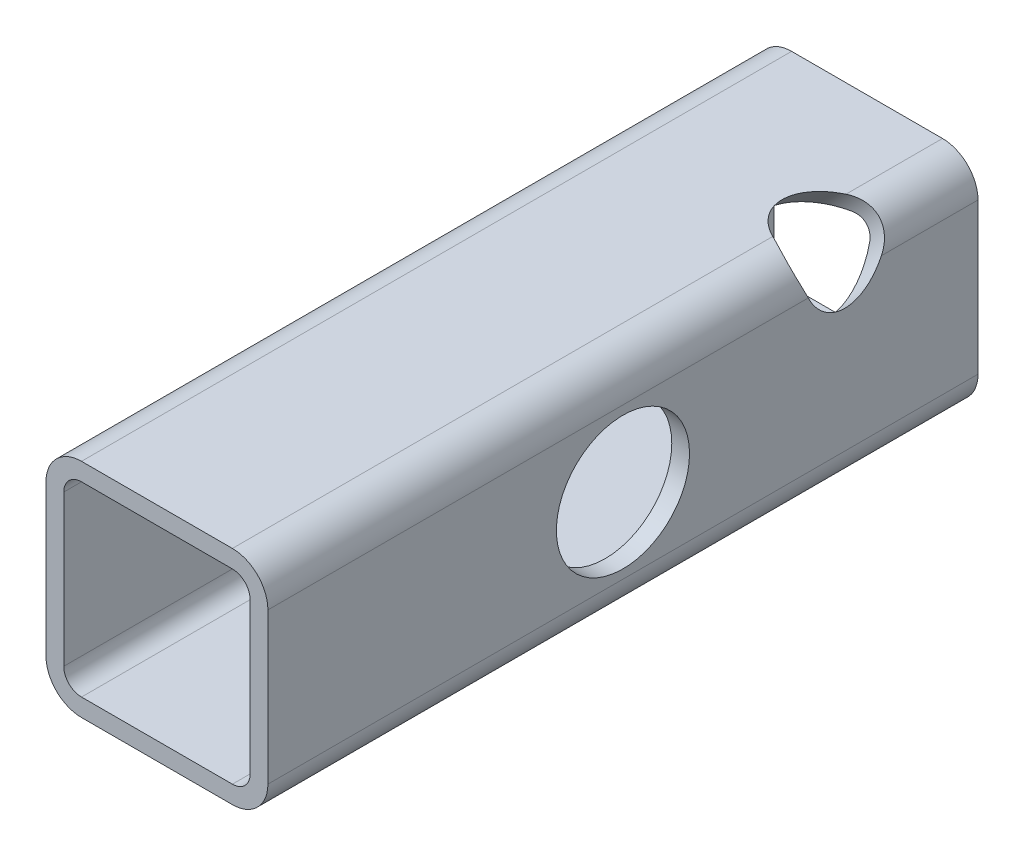
ISO-10303-21;
HEADER;
FILE_DESCRIPTION(('STEP AP214'),'2;1');
FILE_NAME('part.step','',(''),(''),'','','');
FILE_SCHEMA(('AUTOMOTIVE_DESIGN { 1 0 10303 214 1 1 1 1 }'));
ENDSEC;
DATA;
#1=APPLICATION_CONTEXT('core data for automotive mechanical design processes');
#2=APPLICATION_PROTOCOL_DEFINITION('international standard','automotive_design',2000,#1);
#3=PRODUCT_CONTEXT('',#1,'mechanical');
#4=PRODUCT('Part','Part','',(#3));
#5=PRODUCT_RELATED_PRODUCT_CATEGORY('part','',(#4));
#6=PRODUCT_DEFINITION_FORMATION('','',#4);
#7=PRODUCT_DEFINITION_CONTEXT('part definition',#1,'design');
#8=PRODUCT_DEFINITION('design','',#6,#7);
#9=PRODUCT_DEFINITION_SHAPE('','',#8);
#10=(LENGTH_UNIT() NAMED_UNIT(*) SI_UNIT(.MILLI.,.METRE.));
#11=(NAMED_UNIT(*) PLANE_ANGLE_UNIT() SI_UNIT($,.RADIAN.));
#12=(NAMED_UNIT(*) SI_UNIT($,.STERADIAN.) SOLID_ANGLE_UNIT());
#13=UNCERTAINTY_MEASURE_WITH_UNIT(LENGTH_MEASURE(1.E-05),#10,'distance_accuracy_value','');
#14=(GEOMETRIC_REPRESENTATION_CONTEXT(3) GLOBAL_UNCERTAINTY_ASSIGNED_CONTEXT((#13)) GLOBAL_UNIT_ASSIGNED_CONTEXT((#10,
#11,#12)) REPRESENTATION_CONTEXT('',''));
#15=CARTESIAN_POINT('',(0.,0.,0.));
#16=DIRECTION('',(0.,0.,1.));
#17=DIRECTION('',(1.,0.,0.));
#18=AXIS2_PLACEMENT_3D('',#15,#16,#17);
#19=CARTESIAN_POINT('',(8.5,8.5,80.));
#20=DIRECTION('',(0.,0.,-1.));
#21=DIRECTION('',(-1.,0.,0.));
#22=AXIS2_PLACEMENT_3D('',#19,#20,#21);
#23=CYLINDRICAL_SURFACE('',#22,4.);
#24=CARTESIAN_POINT('',(12.5,8.5,10.8768943743823));
#25=CARTESIAN_POINT('',(12.4999900736932,8.60322548582175,10.8268117894162));
#26=CARTESIAN_POINT('',(12.4960026516083,8.70684373620168,10.777473282216));
#27=CARTESIAN_POINT('',(12.4798211637723,8.9146339749652,10.6810516297764));
#28=CARTESIAN_POINT('',(12.4676172554053,9.01880647863846,10.6339712621303));
#29=CARTESIAN_POINT('',(12.4346362042789,9.22794552261682,10.5426421700863));
#30=CARTESIAN_POINT('',(12.4138002846389,9.33291256654859,10.4984153094687));
#31=CARTESIAN_POINT('',(12.3633247715153,9.54227431499125,10.4140348078421));
#32=CARTESIAN_POINT('',(12.3336893465361,9.64666926671869,10.3738792502298));
#33=CARTESIAN_POINT('',(12.2418879174214,9.92551716225092,10.2726151327423));
#34=CARTESIAN_POINT('',(12.1713387006105,10.0990244436357,10.2159727240534));
#35=CARTESIAN_POINT('',(12.0461455016184,10.3530466996695,10.1445602283934));
#36=CARTESIAN_POINT('',(12.0012344812091,10.436609822726,10.1230276605347));
#37=CARTESIAN_POINT('',(11.9050424995219,10.6011294313171,10.0848456206906));
#38=CARTESIAN_POINT('',(11.8537646982885,10.6820871850566,10.0681937399416));
#39=CARTESIAN_POINT('',(11.7446624441855,10.8412699476428,10.0400398488812));
#40=CARTESIAN_POINT('',(11.6867943264408,10.919471627163,10.0285750279255));
#41=CARTESIAN_POINT('',(11.5651945183113,11.0717842756467,10.0112404242424));
#42=CARTESIAN_POINT('',(11.5014653122967,11.1458969567168,10.0053682827932));
#43=CARTESIAN_POINT('',(11.3685706275076,11.2894207030943,9.99935733347444));
#44=CARTESIAN_POINT('',(11.2994018420552,11.3588288600808,9.99922204040594));
#45=CARTESIAN_POINT('',(11.1563057283572,11.4922612010786,10.0046869065742));
#46=CARTESIAN_POINT('',(11.082378722107,11.5562857487314,10.010286678093));
#47=CARTESIAN_POINT('',(10.8688957305008,11.727902135089,10.0339228888907));
#48=CARTESIAN_POINT('',(10.7246003406474,11.8288697360653,10.0583538077691));
#49=CARTESIAN_POINT('',(10.4269881402968,12.0095740260143,10.123784696369));
#50=CARTESIAN_POINT('',(10.2736712366654,12.089310495759,10.1647848371696));
#51=CARTESIAN_POINT('',(9.95316360050183,12.2310465588378,10.2632966851238));
#52=CARTESIAN_POINT('',(9.78567567291917,12.2918115493848,10.3216005596071));
#53=CARTESIAN_POINT('',(9.44839970680853,12.3899139893728,10.4500976510045));
#54=CARTESIAN_POINT('',(9.27861027278672,12.4272365101349,10.5202984080596));
#55=CARTESIAN_POINT('',(9.00702186327651,12.4690796452538,10.6392643664434));
#56=CARTESIAN_POINT('',(8.90509562652709,12.4807451000738,10.6854215521429));
#57=CARTESIAN_POINT('',(8.70199886997217,12.4961864267963,10.7797819561551));
#58=CARTESIAN_POINT('',(8.60082696607659,12.4999882262497,10.8279779142022));
#59=CARTESIAN_POINT('',(8.5,12.5,10.8768943743824));
#60=B_SPLINE_CURVE_WITH_KNOTS('',3,(#24,#25,#26,#27,#28,#29,#30,#31,#32,#33,#34,#35,#36,#37,#38,
#39,#40,#41,#42,#43,#44,#45,#46,#47,#48,#49,#50,#51,#52,#53,#54,#55,#56,#57,#58,#59),
.UNSPECIFIED.,.F.,.F.,(4,2,2,2,2,2,2,2,2,2,2,2,2,2,2,2,2,4),(0.,0.344169396618335,
0.688751812699603,1.03572015363021,1.38252439013617,1.96665480854207,2.25820455863998,
2.54961017708636,2.84307318850472,3.13641237653447,3.42993128240602,3.72343034629238,
4.25421029629236,4.78499572679712,5.34533149161232,5.90602372970775,6.24324687063367,
6.5793563566241),.UNSPECIFIED.);
#61=CARTESIAN_POINT('',(12.5,8.5,10.8768943743823));
#62=VERTEX_POINT('',#61);
#63=CARTESIAN_POINT('',(8.5,12.5,10.8768943743824));
#64=VERTEX_POINT('',#63);
#65=EDGE_CURVE('E47',#62,#64,#60,.T.);
#66=ORIENTED_EDGE('',*,*,#65,.F.);
#67=DIRECTION('',(0.,0.,-1.));
#68=VECTOR('',#67,1.);
#69=CARTESIAN_POINT('',(12.5,8.5,80.));
#70=LINE('',#69,#68);
#71=CARTESIAN_POINT('',(12.5,8.5,0.));
#72=VERTEX_POINT('',#71);
#73=EDGE_CURVE('E252',#62,#72,#70,.T.);
#74=ORIENTED_EDGE('',*,*,#73,.T.);
#75=CARTESIAN_POINT('',(8.5,8.5,0.));
#76=DIRECTION('',(0.,0.,1.));
#77=DIRECTION('',(1.,0.,0.));
#78=AXIS2_PLACEMENT_3D('',#75,#76,#77);
#79=CIRCLE('',#78,4.);
#80=CARTESIAN_POINT('',(8.5,12.5,0.));
#81=VERTEX_POINT('',#80);
#82=EDGE_CURVE('E232',#72,#81,#79,.T.);
#83=ORIENTED_EDGE('',*,*,#82,.T.);
#84=DIRECTION('',(0.,0.,-1.));
#85=VECTOR('',#84,1.);
#86=CARTESIAN_POINT('',(8.5,12.5,80.));
#87=LINE('',#86,#85);
#88=EDGE_CURVE('E248',#64,#81,#87,.T.);
#89=ORIENTED_EDGE('',*,*,#88,.F.);
#90=EDGE_LOOP('',(#66,#74,#83,#89));
#91=FACE_BOUND('',#90,.T.);
#92=ADVANCED_FACE('F32',(#91),#23,.T.);
#93=CARTESIAN_POINT('',(8.5,12.5,19.1231056256176));
#94=CARTESIAN_POINT('',(8.60322548582174,12.4999900736932,19.1731882105838));
#95=CARTESIAN_POINT('',(8.70684373620168,12.4960026516083,19.2225267177839));
#96=CARTESIAN_POINT('',(8.9146339749652,12.4798211637723,19.3189483702236));
#97=CARTESIAN_POINT('',(9.01880647863846,12.4676172554053,19.3660287378697));
#98=CARTESIAN_POINT('',(9.22794552261682,12.4346362042789,19.4573578299136));
#99=CARTESIAN_POINT('',(9.33291256654859,12.4138002846389,19.5015846905313));
#100=CARTESIAN_POINT('',(9.54227431499125,12.3633247715153,19.5859651921579));
#101=CARTESIAN_POINT('',(9.6466692667187,12.3336893465361,19.6261207497702));
#102=CARTESIAN_POINT('',(9.92551716225092,12.2418879174214,19.7273848672577));
#103=CARTESIAN_POINT('',(10.0990244436357,12.1713387006105,19.7840272759466));
#104=CARTESIAN_POINT('',(10.3530466996695,12.0461455016184,19.8554397716066));
#105=CARTESIAN_POINT('',(10.436609822726,12.0012344812091,19.8769723394653));
#106=CARTESIAN_POINT('',(10.6011294313171,11.9050424995219,19.9151543793094));
#107=CARTESIAN_POINT('',(10.6820871850566,11.8537646982885,19.9318062600584));
#108=CARTESIAN_POINT('',(10.8412699476428,11.7446624441855,19.9599601511187));
#109=CARTESIAN_POINT('',(10.919471627163,11.6867943264408,19.9714249720745));
#110=CARTESIAN_POINT('',(11.0717842756467,11.5651945183113,19.9887595757576));
#111=CARTESIAN_POINT('',(11.1458969567168,11.5014653122967,19.9946317172068));
#112=CARTESIAN_POINT('',(11.2894207030943,11.3685706275076,20.0006426665256));
#113=CARTESIAN_POINT('',(11.3588288600808,11.2994018420552,20.0007779595941));
#114=CARTESIAN_POINT('',(11.4922612010786,11.1563057283572,19.9953130934258));
#115=CARTESIAN_POINT('',(11.5562857487314,11.082378722107,19.989713321907));
#116=CARTESIAN_POINT('',(11.727902135089,10.8688957305008,19.9660771111093));
#117=CARTESIAN_POINT('',(11.8288697360653,10.7246003406474,19.9416461922309));
#118=CARTESIAN_POINT('',(12.0095740260143,10.4269881402968,19.8762153036311));
#119=CARTESIAN_POINT('',(12.089310495759,10.2736712366654,19.8352151628304));
#120=CARTESIAN_POINT('',(12.2310465588378,9.95316360050183,19.7367033148762));
#121=CARTESIAN_POINT('',(12.2918115493848,9.78567567291916,19.6783994403929));
#122=CARTESIAN_POINT('',(12.3899139893728,9.44839970680852,19.5499023489955));
#123=CARTESIAN_POINT('',(12.4272365101349,9.27861027278671,19.4797015919404));
#124=CARTESIAN_POINT('',(12.4690796452538,9.0070218632765,19.3607356335566));
#125=CARTESIAN_POINT('',(12.4807451000738,8.90509562652709,19.3145784478572));
#126=CARTESIAN_POINT('',(12.4961864267963,8.70199886997217,19.220218043845));
#127=CARTESIAN_POINT('',(12.4999882262497,8.60082696607659,19.1720220857979));
#128=CARTESIAN_POINT('',(12.5,8.5,19.1231056256177));
#129=B_SPLINE_CURVE_WITH_KNOTS('',3,(#93,#94,#95,#96,#97,#98,#99,#100,#101,#102,#103,#104,#105,
#106,#107,#108,#109,#110,#111,#112,#113,#114,#115,#116,#117,#118,#119,#120,#121,#122,#123,#124,
#125,#126,#127,#128),.UNSPECIFIED.,.F.,.F.,(4,2,2,2,2,2,2,2,2,2,2,2,2,2,2,2,2,4),(0.,
0.344169396618342,0.688751812699611,1.03572015363022,1.38252439013618,1.96665480854208,
2.25820455863999,2.54961017708637,2.84307318850474,3.13641237653449,3.42993128240604,
3.7234303462924,4.25421029629238,4.78499572679714,5.34533149161234,5.90602372970777,
6.24324687063368,6.5793563566241),.UNSPECIFIED.);
#130=CARTESIAN_POINT('',(8.5,12.5,19.1231056256176));
#131=VERTEX_POINT('',#130);
#132=CARTESIAN_POINT('',(12.5,8.5,19.1231056256177));
#133=VERTEX_POINT('',#132);
#134=EDGE_CURVE('E343',#131,#133,#129,.T.);
#135=ORIENTED_EDGE('',*,*,#134,.F.);
#136=CARTESIAN_POINT('',(8.5,12.5,80.));
#137=VERTEX_POINT('',#136);
#138=EDGE_CURVE('E249',#137,#131,#87,.T.);
#139=ORIENTED_EDGE('',*,*,#138,.F.);
#140=CARTESIAN_POINT('',(8.5,8.5,80.));
#141=DIRECTION('',(0.,0.,1.));
#142=DIRECTION('',(1.,0.,0.));
#143=AXIS2_PLACEMENT_3D('',#140,#141,#142);
#144=CIRCLE('',#143,4.);
#145=CARTESIAN_POINT('',(12.5,8.5,80.));
#146=VERTEX_POINT('',#145);
#147=EDGE_CURVE('E214',#146,#137,#144,.T.);
#148=ORIENTED_EDGE('',*,*,#147,.F.);
#149=EDGE_CURVE('E253',#146,#133,#70,.T.);
#150=ORIENTED_EDGE('',*,*,#149,.T.);
#151=EDGE_LOOP('',(#135,#139,#148,#150));
#152=FACE_BOUND('',#151,.T.);
#153=ADVANCED_FACE('F382',(#152),#23,.T.);
#154=CARTESIAN_POINT('',(8.5,8.5,80.));
#155=DIRECTION('',(0.,0.,-1.));
#156=DIRECTION('',(-1.,0.,0.));
#157=AXIS2_PLACEMENT_3D('',#154,#155,#156);
#158=CYLINDRICAL_SURFACE('',#157,2.);
#159=DIRECTION('',(0.,0.,-1.));
#160=VECTOR('',#159,1.);
#161=CARTESIAN_POINT('',(10.5,8.5,80.));
#162=LINE('',#161,#160);
#163=CARTESIAN_POINT('',(10.5,8.5,10.2041684766873));
#164=VERTEX_POINT('',#163);
#165=CARTESIAN_POINT('',(10.5,8.5,0.));
#166=VERTEX_POINT('',#165);
#167=EDGE_CURVE('E179',#164,#166,#162,.T.);
#168=ORIENTED_EDGE('',*,*,#167,.F.);
#169=CARTESIAN_POINT('',(10.5,8.5,10.2041684766873));
#170=CARTESIAN_POINT('',(10.4999966401315,8.55538061783494,10.192619930631));
#171=CARTESIAN_POINT('',(10.4976983985441,8.61074579064035,10.1811185631784));
#172=CARTESIAN_POINT('',(10.4885056986867,8.72118326541717,10.158491332697));
#173=CARTESIAN_POINT('',(10.4816101749542,8.77625549651358,10.1473655573432));
#174=CARTESIAN_POINT('',(10.4539952007752,8.94074630801792,10.1149530055089));
#175=CARTESIAN_POINT('',(10.4263473086495,9.04929062754437,10.0946631489282));
#176=CARTESIAN_POINT('',(10.3529086237973,9.26113857082425,10.0588934667006));
#177=CARTESIAN_POINT('',(10.3070807259505,9.36443098604869,10.0434235945834));
#178=CARTESIAN_POINT('',(10.1983030549394,9.56229801118936,10.0190754794664));
#179=CARTESIAN_POINT('',(10.135377920967,9.65688490621743,10.0101878188479));
#180=CARTESIAN_POINT('',(9.99758231435252,9.82999854819255,10.0002515805546));
#181=CARTESIAN_POINT('',(9.92343260976138,9.90907918802789,9.99884626772938));
#182=CARTESIAN_POINT('',(9.76343369782625,10.0541537499055,10.003063377503));
#183=CARTESIAN_POINT('',(9.67758333782971,10.1201463810501,10.0086864929314));
#184=CARTESIAN_POINT('',(9.49963668786366,10.2354046990749,10.0260850979742));
#185=CARTESIAN_POINT('',(9.40781015743875,10.2851184999902,10.0376680508348));
#186=CARTESIAN_POINT('',(9.21815988063607,10.3694979557752,10.0657518898722));
#187=CARTESIAN_POINT('',(9.12033373826981,10.4041575533907,10.0822547511426));
#188=CARTESIAN_POINT('',(8.93555947750822,10.4539908817783,10.1160180851495));
#189=CARTESIAN_POINT('',(8.84908114036888,10.4712560862184,10.1328248101576));
#190=CARTESIAN_POINT('',(8.67505634136552,10.4942552158266,10.1677693866349));
#191=CARTESIAN_POINT('',(8.58751248863528,10.5000131579932,10.1859043836098));
#192=CARTESIAN_POINT('',(8.5,10.5,10.2041684766873));
#193=B_SPLINE_CURVE_WITH_KNOTS('',3,(#169,#170,#171,#172,#173,#174,#175,#176,#177,#178,#179,
#180,#181,#182,#183,#184,#185,#186,#187,#188,#189,#190,#191,#192),.UNSPECIFIED.,.F.,.F.,(4,2,2,
2,2,2,2,2,2,2,2,4),(0.,0.169618502998704,0.339276330326358,0.679041963432508,1.01950465061232,
1.35947926852843,1.68308952907488,2.00673169212234,2.32051978880055,2.63443402549675,
2.90300532172263,3.17101549048092),.UNSPECIFIED.);
#194=CARTESIAN_POINT('',(8.5,10.5,10.2041684766873));
#195=VERTEX_POINT('',#194);
#196=EDGE_CURVE('E167',#164,#195,#193,.T.);
#197=ORIENTED_EDGE('',*,*,#196,.T.);
#198=DIRECTION('',(0.,0.,-1.));
#199=VECTOR('',#198,1.);
#200=CARTESIAN_POINT('',(8.5,10.5,80.));
#201=LINE('',#200,#199);
#202=CARTESIAN_POINT('',(8.5,10.5,0.));
#203=VERTEX_POINT('',#202);
#204=EDGE_CURVE('E177',#195,#203,#201,.T.);
#205=ORIENTED_EDGE('',*,*,#204,.T.);
#206=CARTESIAN_POINT('',(8.5,8.5,0.));
#207=DIRECTION('',(0.,0.,1.));
#208=DIRECTION('',(1.,0.,0.));
#209=AXIS2_PLACEMENT_3D('',#206,#207,#208);
#210=CIRCLE('',#209,2.);
#211=EDGE_CURVE('E313',#166,#203,#210,.T.);
#212=ORIENTED_EDGE('',*,*,#211,.F.);
#213=EDGE_LOOP('',(#168,#197,#205,#212));
#214=FACE_BOUND('',#213,.T.);
#215=ADVANCED_FACE('F175',(#214),#158,.F.);
#216=CARTESIAN_POINT('',(8.5,10.5,80.));
#217=VERTEX_POINT('',#216);
#218=CARTESIAN_POINT('',(8.5,10.5,19.7958315233127));
#219=VERTEX_POINT('',#218);
#220=EDGE_CURVE('E186',#217,#219,#201,.T.);
#221=ORIENTED_EDGE('',*,*,#220,.T.);
#222=CARTESIAN_POINT('',(8.5,10.5,19.7958315233127));
#223=CARTESIAN_POINT('',(8.55538061783494,10.4999966401316,19.807380069369));
#224=CARTESIAN_POINT('',(8.61074579064035,10.4976983985441,19.8188814368216));
#225=CARTESIAN_POINT('',(8.72118326541717,10.4885056986867,19.841508667303));
#226=CARTESIAN_POINT('',(8.77625549651358,10.4816101749542,19.8526344426568));
#227=CARTESIAN_POINT('',(8.94074630801792,10.4539952007752,19.8850469944911));
#228=CARTESIAN_POINT('',(9.04929062754437,10.4263473086495,19.9053368510718));
#229=CARTESIAN_POINT('',(9.26113857082425,10.3529086237973,19.9411065332994));
#230=CARTESIAN_POINT('',(9.36443098604869,10.3070807259505,19.9565764054166));
#231=CARTESIAN_POINT('',(9.56229801118936,10.1983030549394,19.9809245205336));
#232=CARTESIAN_POINT('',(9.65688490621744,10.135377920967,19.9898121811521));
#233=CARTESIAN_POINT('',(9.82999854819255,9.99758231435251,19.9997484194454));
#234=CARTESIAN_POINT('',(9.90907918802789,9.92343260976138,20.0011537322706));
#235=CARTESIAN_POINT('',(10.0541537499055,9.76343369782625,19.996936622497));
#236=CARTESIAN_POINT('',(10.1201463810501,9.67758333782971,19.9913135070686));
#237=CARTESIAN_POINT('',(10.2354046990749,9.49963668786366,19.9739149020258));
#238=CARTESIAN_POINT('',(10.2851184999902,9.40781015743875,19.9623319491652));
#239=CARTESIAN_POINT('',(10.3694979557752,9.21815988063607,19.9342481101278));
#240=CARTESIAN_POINT('',(10.4041575533907,9.12033373826981,19.9177452488574));
#241=CARTESIAN_POINT('',(10.4539908817783,8.93555947750821,19.8839819148505));
#242=CARTESIAN_POINT('',(10.4712560862184,8.84908114036888,19.8671751898424));
#243=CARTESIAN_POINT('',(10.4942552158266,8.67505634136552,19.8322306133651));
#244=CARTESIAN_POINT('',(10.5000131579932,8.58751248863528,19.8140956163902));
#245=CARTESIAN_POINT('',(10.5,8.5,19.7958315233127));
#246=B_SPLINE_CURVE_WITH_KNOTS('',3,(#222,#223,#224,#225,#226,#227,#228,#229,#230,#231,#232,
#233,#234,#235,#236,#237,#238,#239,#240,#241,#242,#243,#244,#245),.UNSPECIFIED.,.F.,.F.,(4,2,2,
2,2,2,2,2,2,2,2,4),(0.,0.169618502998705,0.33927633032636,0.679041963432511,1.01950465061232,
1.35947926852844,1.68308952907488,2.00673169212235,2.32051978880056,2.63443402549675,
2.90300532172263,3.17101549048092),.UNSPECIFIED.);
#247=CARTESIAN_POINT('',(10.5,8.5,19.7958315233127));
#248=VERTEX_POINT('',#247);
#249=EDGE_CURVE('E55',#219,#248,#246,.T.);
#250=ORIENTED_EDGE('',*,*,#249,.T.);
#251=CARTESIAN_POINT('',(10.5,8.5,80.));
#252=VERTEX_POINT('',#251);
#253=EDGE_CURVE('E193',#252,#248,#162,.T.);
#254=ORIENTED_EDGE('',*,*,#253,.F.);
#255=CARTESIAN_POINT('',(8.5,8.5,80.));
#256=DIRECTION('',(0.,0.,1.));
#257=DIRECTION('',(1.,0.,0.));
#258=AXIS2_PLACEMENT_3D('',#255,#256,#257);
#259=CIRCLE('',#258,2.);
#260=EDGE_CURVE('E292',#252,#217,#259,.T.);
#261=ORIENTED_EDGE('',*,*,#260,.T.);
#262=EDGE_LOOP('',(#221,#250,#254,#261));
#263=FACE_BOUND('',#262,.T.);
#264=ADVANCED_FACE('F381',(#263),#158,.F.);
#265=CARTESIAN_POINT('',(-8.5,-8.5,80.));
#266=DIRECTION('',(0.,0.,1.));
#267=DIRECTION('',(1.,0.,0.));
#268=AXIS2_PLACEMENT_3D('',#265,#266,#267);
#269=PLANE('',#268);
#270=CARTESIAN_POINT('',(-8.5,-8.5,80.));
#271=DIRECTION('',(0.,0.,1.));
#272=DIRECTION('',(1.,0.,0.));
#273=AXIS2_PLACEMENT_3D('',#270,#271,#272);
#274=CIRCLE('',#273,4.);
#275=CARTESIAN_POINT('',(-12.5,-8.5,80.));
#276=VERTEX_POINT('',#275);
#277=CARTESIAN_POINT('',(-8.5,-12.5,80.));
#278=VERTEX_POINT('',#277);
#279=EDGE_CURVE('E204',#276,#278,#274,.T.);
#280=ORIENTED_EDGE('',*,*,#279,.T.);
#281=DIRECTION('',(1.,0.,0.));
#282=VECTOR('',#281,1.);
#283=CARTESIAN_POINT('',(8.5,-12.5,80.));
#284=LINE('',#283,#282);
#285=CARTESIAN_POINT('',(8.5,-12.5,80.));
#286=VERTEX_POINT('',#285);
#287=EDGE_CURVE('E207',#278,#286,#284,.T.);
#288=ORIENTED_EDGE('',*,*,#287,.T.);
#289=CARTESIAN_POINT('',(8.5,-8.5,80.));
#290=DIRECTION('',(0.,0.,1.));
#291=DIRECTION('',(1.,0.,0.));
#292=AXIS2_PLACEMENT_3D('',#289,#290,#291);
#293=CIRCLE('',#292,4.);
#294=CARTESIAN_POINT('',(12.5,-8.5,80.));
#295=VERTEX_POINT('',#294);
#296=EDGE_CURVE('E210',#286,#295,#293,.T.);
#297=ORIENTED_EDGE('',*,*,#296,.T.);
#298=DIRECTION('',(0.,1.,0.));
#299=VECTOR('',#298,1.);
#300=CARTESIAN_POINT('',(12.5,-8.5,80.));
#301=LINE('',#300,#299);
#302=EDGE_CURVE('E212',#295,#146,#301,.T.);
#303=ORIENTED_EDGE('',*,*,#302,.T.);
#304=ORIENTED_EDGE('',*,*,#147,.T.);
#305=DIRECTION('',(-1.,0.,0.));
#306=VECTOR('',#305,1.);
#307=CARTESIAN_POINT('',(8.5,12.5,80.));
#308=LINE('',#307,#306);
#309=CARTESIAN_POINT('',(-8.5,12.5,80.));
#310=VERTEX_POINT('',#309);
#311=EDGE_CURVE('E216',#137,#310,#308,.T.);
#312=ORIENTED_EDGE('',*,*,#311,.T.);
#313=CARTESIAN_POINT('',(-8.5,8.5,80.));
#314=DIRECTION('',(0.,0.,1.));
#315=DIRECTION('',(-1.,0.,0.));
#316=AXIS2_PLACEMENT_3D('',#313,#314,#315);
#317=CIRCLE('',#316,4.);
#318=CARTESIAN_POINT('',(-12.5,8.5,80.));
#319=VERTEX_POINT('',#318);
#320=EDGE_CURVE('E218',#310,#319,#317,.T.);
#321=ORIENTED_EDGE('',*,*,#320,.T.);
#322=DIRECTION('',(0.,-1.,0.));
#323=VECTOR('',#322,1.);
#324=CARTESIAN_POINT('',(-12.5,-8.5,80.));
#325=LINE('',#324,#323);
#326=EDGE_CURVE('E220',#319,#276,#325,.T.);
#327=ORIENTED_EDGE('',*,*,#326,.T.);
#328=EDGE_LOOP('',(#280,#288,#297,#303,#304,#312,#321,#327));
#329=FACE_BOUND('',#328,.T.);
#330=DIRECTION('',(1.,0.,0.));
#331=VECTOR('',#330,1.);
#332=CARTESIAN_POINT('',(8.5,-10.5,80.));
#333=LINE('',#332,#331);
#334=CARTESIAN_POINT('',(-8.5,-10.5,80.));
#335=VERTEX_POINT('',#334);
#336=CARTESIAN_POINT('',(8.5,-10.5,80.));
#337=VERTEX_POINT('',#336);
#338=EDGE_CURVE('E285',#335,#337,#333,.T.);
#339=ORIENTED_EDGE('',*,*,#338,.F.);
#340=CARTESIAN_POINT('',(-8.5,-8.5,80.));
#341=DIRECTION('',(0.,0.,1.));
#342=DIRECTION('',(1.,0.,0.));
#343=AXIS2_PLACEMENT_3D('',#340,#341,#342);
#344=CIRCLE('',#343,2.);
#345=CARTESIAN_POINT('',(-10.5,-8.5,80.));
#346=VERTEX_POINT('',#345);
#347=EDGE_CURVE('E283',#346,#335,#344,.T.);
#348=ORIENTED_EDGE('',*,*,#347,.F.);
#349=DIRECTION('',(0.,-1.,0.));
#350=VECTOR('',#349,1.);
#351=CARTESIAN_POINT('',(-10.5,-8.5,80.));
#352=LINE('',#351,#350);
#353=CARTESIAN_POINT('',(-10.5,8.5,80.));
#354=VERTEX_POINT('',#353);
#355=EDGE_CURVE('E299',#354,#346,#352,.T.);
#356=ORIENTED_EDGE('',*,*,#355,.F.);
#357=CARTESIAN_POINT('',(-8.5,8.5,80.));
#358=DIRECTION('',(0.,0.,1.));
#359=DIRECTION('',(-1.,0.,0.));
#360=AXIS2_PLACEMENT_3D('',#357,#358,#359);
#361=CIRCLE('',#360,2.);
#362=CARTESIAN_POINT('',(-8.5,10.5,80.));
#363=VERTEX_POINT('',#362);
#364=EDGE_CURVE('E296',#363,#354,#361,.T.);
#365=ORIENTED_EDGE('',*,*,#364,.F.);
#366=DIRECTION('',(-1.,0.,0.));
#367=VECTOR('',#366,1.);
#368=CARTESIAN_POINT('',(8.5,10.5,80.));
#369=LINE('',#368,#367);
#370=EDGE_CURVE('E294',#217,#363,#369,.T.);
#371=ORIENTED_EDGE('',*,*,#370,.F.);
#372=ORIENTED_EDGE('',*,*,#260,.F.);
#373=DIRECTION('',(0.,1.,0.));
#374=VECTOR('',#373,1.);
#375=CARTESIAN_POINT('',(10.5,-8.5,80.));
#376=LINE('',#375,#374);
#377=CARTESIAN_POINT('',(10.5,-8.5,80.));
#378=VERTEX_POINT('',#377);
#379=EDGE_CURVE('E290',#378,#252,#376,.T.);
#380=ORIENTED_EDGE('',*,*,#379,.F.);
#381=CARTESIAN_POINT('',(8.5,-8.5,80.));
#382=DIRECTION('',(0.,0.,1.));
#383=DIRECTION('',(1.,0.,0.));
#384=AXIS2_PLACEMENT_3D('',#381,#382,#383);
#385=CIRCLE('',#384,2.);
#386=EDGE_CURVE('E288',#337,#378,#385,.T.);
#387=ORIENTED_EDGE('',*,*,#386,.F.);
#388=EDGE_LOOP('',(#339,#348,#356,#365,#371,#372,#380,#387));
#389=FACE_BOUND('',#388,.T.);
#390=ADVANCED_FACE('F401',(#329,#389),#269,.T.);
#391=CARTESIAN_POINT('',(-8.5,-8.5,0.));
#392=DIRECTION('',(0.,0.,1.));
#393=DIRECTION('',(1.,0.,0.));
#394=AXIS2_PLACEMENT_3D('',#391,#392,#393);
#395=PLANE('',#394);
#396=CARTESIAN_POINT('',(-8.5,-8.5,0.));
#397=DIRECTION('',(0.,0.,1.));
#398=DIRECTION('',(1.,0.,0.));
#399=AXIS2_PLACEMENT_3D('',#396,#397,#398);
#400=CIRCLE('',#399,4.);
#401=CARTESIAN_POINT('',(-12.5,-8.5,0.));
#402=VERTEX_POINT('',#401);
#403=CARTESIAN_POINT('',(-8.5,-12.5,0.));
#404=VERTEX_POINT('',#403);
#405=EDGE_CURVE('E203',#402,#404,#400,.T.);
#406=ORIENTED_EDGE('',*,*,#405,.F.);
#407=DIRECTION('',(0.,-1.,0.));
#408=VECTOR('',#407,1.);
#409=CARTESIAN_POINT('',(-12.5,-8.5,0.));
#410=LINE('',#409,#408);
#411=CARTESIAN_POINT('',(-12.5,8.5,0.));
#412=VERTEX_POINT('',#411);
#413=EDGE_CURVE('E208',#412,#402,#410,.T.);
#414=ORIENTED_EDGE('',*,*,#413,.F.);
#415=CARTESIAN_POINT('',(-8.5,8.5,0.));
#416=DIRECTION('',(0.,0.,1.));
#417=DIRECTION('',(-1.,0.,0.));
#418=AXIS2_PLACEMENT_3D('',#415,#416,#417);
#419=CIRCLE('',#418,4.);
#420=CARTESIAN_POINT('',(-8.5,12.5,0.));
#421=VERTEX_POINT('',#420);
#422=EDGE_CURVE('E237',#421,#412,#419,.T.);
#423=ORIENTED_EDGE('',*,*,#422,.F.);
#424=DIRECTION('',(-1.,0.,0.));
#425=VECTOR('',#424,1.);
#426=CARTESIAN_POINT('',(8.5,12.5,0.));
#427=LINE('',#426,#425);
#428=EDGE_CURVE('E235',#81,#421,#427,.T.);
#429=ORIENTED_EDGE('',*,*,#428,.F.);
#430=ORIENTED_EDGE('',*,*,#82,.F.);
#431=DIRECTION('',(0.,1.,0.));
#432=VECTOR('',#431,1.);
#433=CARTESIAN_POINT('',(12.5,-8.5,0.));
#434=LINE('',#433,#432);
#435=CARTESIAN_POINT('',(12.5,-8.5,0.));
#436=VERTEX_POINT('',#435);
#437=EDGE_CURVE('E229',#436,#72,#434,.T.);
#438=ORIENTED_EDGE('',*,*,#437,.F.);
#439=CARTESIAN_POINT('',(8.5,-8.5,0.));
#440=DIRECTION('',(0.,0.,1.));
#441=DIRECTION('',(1.,0.,0.));
#442=AXIS2_PLACEMENT_3D('',#439,#440,#441);
#443=CIRCLE('',#442,4.);
#444=CARTESIAN_POINT('',(8.5,-12.5,0.));
#445=VERTEX_POINT('',#444);
#446=EDGE_CURVE('E227',#445,#436,#443,.T.);
#447=ORIENTED_EDGE('',*,*,#446,.F.);
#448=DIRECTION('',(1.,0.,0.));
#449=VECTOR('',#448,1.);
#450=CARTESIAN_POINT('',(8.5,-12.5,0.));
#451=LINE('',#450,#449);
#452=EDGE_CURVE('E225',#404,#445,#451,.T.);
#453=ORIENTED_EDGE('',*,*,#452,.F.);
#454=EDGE_LOOP('',(#406,#414,#423,#429,#430,#438,#447,#453));
#455=FACE_BOUND('',#454,.T.);
#456=CARTESIAN_POINT('',(-8.5,-8.5,0.));
#457=DIRECTION('',(0.,0.,1.));
#458=DIRECTION('',(1.,0.,0.));
#459=AXIS2_PLACEMENT_3D('',#456,#457,#458);
#460=CIRCLE('',#459,2.);
#461=CARTESIAN_POINT('',(-10.5,-8.5,0.));
#462=VERTEX_POINT('',#461);
#463=CARTESIAN_POINT('',(-8.5,-10.5,0.));
#464=VERTEX_POINT('',#463);
#465=EDGE_CURVE('E266',#462,#464,#460,.T.);
#466=ORIENTED_EDGE('',*,*,#465,.T.);
#467=DIRECTION('',(1.,0.,0.));
#468=VECTOR('',#467,1.);
#469=CARTESIAN_POINT('',(8.5,-10.5,0.));
#470=LINE('',#469,#468);
#471=CARTESIAN_POINT('',(8.5,-10.5,0.));
#472=VERTEX_POINT('',#471);
#473=EDGE_CURVE('E304',#464,#472,#470,.T.);
#474=ORIENTED_EDGE('',*,*,#473,.T.);
#475=CARTESIAN_POINT('',(8.5,-8.5,0.));
#476=DIRECTION('',(0.,0.,1.));
#477=DIRECTION('',(1.,0.,0.));
#478=AXIS2_PLACEMENT_3D('',#475,#476,#477);
#479=CIRCLE('',#478,2.);
#480=CARTESIAN_POINT('',(10.5,-8.5,0.));
#481=VERTEX_POINT('',#480);
#482=EDGE_CURVE('E307',#472,#481,#479,.T.);
#483=ORIENTED_EDGE('',*,*,#482,.T.);
#484=DIRECTION('',(0.,1.,0.));
#485=VECTOR('',#484,1.);
#486=CARTESIAN_POINT('',(10.5,-8.5,0.));
#487=LINE('',#486,#485);
#488=EDGE_CURVE('E310',#481,#166,#487,.T.);
#489=ORIENTED_EDGE('',*,*,#488,.T.);
#490=ORIENTED_EDGE('',*,*,#211,.T.);
#491=DIRECTION('',(-1.,0.,0.));
#492=VECTOR('',#491,1.);
#493=CARTESIAN_POINT('',(8.5,10.5,0.));
#494=LINE('',#493,#492);
#495=CARTESIAN_POINT('',(-8.5,10.5,0.));
#496=VERTEX_POINT('',#495);
#497=EDGE_CURVE('E184',#203,#496,#494,.T.);
#498=ORIENTED_EDGE('',*,*,#497,.T.);
#499=CARTESIAN_POINT('',(-8.5,8.5,0.));
#500=DIRECTION('',(0.,0.,1.));
#501=DIRECTION('',(-1.,0.,0.));
#502=AXIS2_PLACEMENT_3D('',#499,#500,#501);
#503=CIRCLE('',#502,2.);
#504=CARTESIAN_POINT('',(-10.5,8.5,0.));
#505=VERTEX_POINT('',#504);
#506=EDGE_CURVE('E316',#496,#505,#503,.T.);
#507=ORIENTED_EDGE('',*,*,#506,.T.);
#508=DIRECTION('',(0.,-1.,0.));
#509=VECTOR('',#508,1.);
#510=CARTESIAN_POINT('',(-10.5,-8.5,0.));
#511=LINE('',#510,#509);
#512=EDGE_CURVE('E286',#505,#462,#511,.T.);
#513=ORIENTED_EDGE('',*,*,#512,.T.);
#514=EDGE_LOOP('',(#466,#474,#483,#489,#490,#498,#507,#513));
#515=FACE_BOUND('',#514,.T.);
#516=ADVANCED_FACE('F333',(#455,#515),#395,.F.);
#517=CARTESIAN_POINT('',(-8.5,-8.5,80.));
#518=DIRECTION('',(0.,0.,-1.));
#519=DIRECTION('',(-1.,0.,0.));
#520=AXIS2_PLACEMENT_3D('',#517,#518,#519);
#521=CYLINDRICAL_SURFACE('',#520,4.);
#522=ORIENTED_EDGE('',*,*,#405,.T.);
#523=DIRECTION('',(0.,0.,-1.));
#524=VECTOR('',#523,1.);
#525=CARTESIAN_POINT('',(-8.5,-12.5,80.));
#526=LINE('',#525,#524);
#527=EDGE_CURVE('E40',#278,#404,#526,.T.);
#528=ORIENTED_EDGE('',*,*,#527,.F.);
#529=ORIENTED_EDGE('',*,*,#279,.F.);
#530=DIRECTION('',(0.,0.,-1.));
#531=VECTOR('',#530,1.);
#532=CARTESIAN_POINT('',(-12.5,-8.5,80.));
#533=LINE('',#532,#531);
#534=EDGE_CURVE('E222',#276,#402,#533,.T.);
#535=ORIENTED_EDGE('',*,*,#534,.T.);
#536=EDGE_LOOP('',(#522,#528,#529,#535));
#537=FACE_BOUND('',#536,.T.);
#538=ADVANCED_FACE('F34',(#537),#521,.T.);
#539=CARTESIAN_POINT('',(8.5,-12.5,80.));
#540=DIRECTION('',(0.,1.,0.));
#541=DIRECTION('',(-1.,0.,0.));
#542=AXIS2_PLACEMENT_3D('',#539,#540,#541);
#543=PLANE('',#542);
#544=ORIENTED_EDGE('',*,*,#452,.T.);
#545=DIRECTION('',(0.,0.,-1.));
#546=VECTOR('',#545,1.);
#547=CARTESIAN_POINT('',(8.5,-12.5,80.));
#548=LINE('',#547,#546);
#549=EDGE_CURVE('E259',#286,#445,#548,.T.);
#550=ORIENTED_EDGE('',*,*,#549,.F.);
#551=ORIENTED_EDGE('',*,*,#287,.F.);
#552=ORIENTED_EDGE('',*,*,#527,.T.);
#553=EDGE_LOOP('',(#544,#550,#551,#552));
#554=FACE_BOUND('',#553,.T.);
#555=ADVANCED_FACE('F458',(#554),#543,.F.);
#556=CARTESIAN_POINT('',(8.5,-8.5,80.));
#557=DIRECTION('',(0.,0.,-1.));
#558=DIRECTION('',(-1.,0.,0.));
#559=AXIS2_PLACEMENT_3D('',#556,#557,#558);
#560=CYLINDRICAL_SURFACE('',#559,4.);
#561=ORIENTED_EDGE('',*,*,#446,.T.);
#562=DIRECTION('',(0.,0.,-1.));
#563=VECTOR('',#562,1.);
#564=CARTESIAN_POINT('',(12.5,-8.5,80.));
#565=LINE('',#564,#563);
#566=EDGE_CURVE('E256',#295,#436,#565,.T.);
#567=ORIENTED_EDGE('',*,*,#566,.F.);
#568=ORIENTED_EDGE('',*,*,#296,.F.);
#569=ORIENTED_EDGE('',*,*,#549,.T.);
#570=EDGE_LOOP('',(#561,#567,#568,#569));
#571=FACE_BOUND('',#570,.T.);
#572=ADVANCED_FACE('F421',(#571),#560,.T.);
#573=CARTESIAN_POINT('',(12.5,-8.5,80.));
#574=DIRECTION('',(-1.,0.,0.));
#575=DIRECTION('',(0.,0.,1.));
#576=AXIS2_PLACEMENT_3D('',#573,#574,#575);
#577=PLANE('',#576);
#578=CARTESIAN_POINT('',(12.5,12.5,15.));
#579=DIRECTION('',(-1.,0.,0.));
#580=DIRECTION('',(0.,-1.,0.));
#581=AXIS2_PLACEMENT_3D('',#578,#579,#580);
#582=ELLIPSE('',#581,7.07106781186546,5.);
#583=EDGE_CURVE('E276',#133,#62,#582,.F.);
#584=ORIENTED_EDGE('',*,*,#583,.F.);
#585=ORIENTED_EDGE('',*,*,#149,.F.);
#586=ORIENTED_EDGE('',*,*,#302,.F.);
#587=ORIENTED_EDGE('',*,*,#566,.T.);
#588=ORIENTED_EDGE('',*,*,#437,.T.);
#589=ORIENTED_EDGE('',*,*,#73,.F.);
#590=EDGE_LOOP('',(#584,#585,#586,#587,#588,#589));
#591=FACE_BOUND('',#590,.T.);
#592=CARTESIAN_POINT('',(12.5,0.,40.));
#593=DIRECTION('',(1.,0.,0.));
#594=DIRECTION('',(0.,0.,-1.));
#595=AXIS2_PLACEMENT_3D('',#592,#593,#594);
#596=CIRCLE('',#595,7.5);
#597=CARTESIAN_POINT('',(12.5,0.,32.5));
#598=VERTEX_POINT('',#597);
#599=EDGE_CURVE('E267',#598,#598,#596,.T.);
#600=ORIENTED_EDGE('',*,*,#599,.F.);
#601=EDGE_LOOP('',(#600));
#602=FACE_BOUND('',#601,.T.);
#603=ADVANCED_FACE('F416',(#591,#602),#577,.F.);
#604=CARTESIAN_POINT('',(8.5,12.5,80.));
#605=DIRECTION('',(0.,-1.,0.));
#606=DIRECTION('',(0.,0.,-1.));
#607=AXIS2_PLACEMENT_3D('',#604,#605,#606);
#608=PLANE('',#607);
#609=CARTESIAN_POINT('',(12.5,12.5,15.));
#610=DIRECTION('',(0.,-1.,0.));
#611=DIRECTION('',(-1.,0.,0.));
#612=AXIS2_PLACEMENT_3D('',#609,#610,#611);
#613=ELLIPSE('',#612,7.07106781186549,5.);
#614=EDGE_CURVE('E341',#64,#131,#613,.F.);
#615=ORIENTED_EDGE('',*,*,#614,.F.);
#616=ORIENTED_EDGE('',*,*,#88,.T.);
#617=ORIENTED_EDGE('',*,*,#428,.T.);
#618=DIRECTION('',(0.,0.,-1.));
#619=VECTOR('',#618,1.);
#620=CARTESIAN_POINT('',(-8.5,12.5,80.));
#621=LINE('',#620,#619);
#622=EDGE_CURVE('E245',#310,#421,#621,.T.);
#623=ORIENTED_EDGE('',*,*,#622,.F.);
#624=ORIENTED_EDGE('',*,*,#311,.F.);
#625=ORIENTED_EDGE('',*,*,#138,.T.);
#626=EDGE_LOOP('',(#615,#616,#617,#623,#624,#625));
#627=FACE_BOUND('',#626,.T.);
#628=ADVANCED_FACE('F413',(#627),#608,.F.);
#629=CARTESIAN_POINT('',(-8.5,8.5,80.));
#630=DIRECTION('',(0.,0.,-1.));
#631=DIRECTION('',(-1.,0.,0.));
#632=AXIS2_PLACEMENT_3D('',#629,#630,#631);
#633=CYLINDRICAL_SURFACE('',#632,4.);
#634=ORIENTED_EDGE('',*,*,#422,.T.);
#635=DIRECTION('',(0.,0.,-1.));
#636=VECTOR('',#635,1.);
#637=CARTESIAN_POINT('',(-12.5,8.5,80.));
#638=LINE('',#637,#636);
#639=EDGE_CURVE('E242',#319,#412,#638,.T.);
#640=ORIENTED_EDGE('',*,*,#639,.F.);
#641=ORIENTED_EDGE('',*,*,#320,.F.);
#642=ORIENTED_EDGE('',*,*,#622,.T.);
#643=EDGE_LOOP('',(#634,#640,#641,#642));
#644=FACE_BOUND('',#643,.T.);
#645=ADVANCED_FACE('F410',(#644),#633,.T.);
#646=CARTESIAN_POINT('',(-12.5,-8.5,80.));
#647=DIRECTION('',(1.,0.,0.));
#648=DIRECTION('',(0.,0.,-1.));
#649=AXIS2_PLACEMENT_3D('',#646,#647,#648);
#650=PLANE('',#649);
#651=CARTESIAN_POINT('',(-12.5,0.,40.));
#652=DIRECTION('',(-1.,0.,0.));
#653=DIRECTION('',(0.,0.,1.));
#654=AXIS2_PLACEMENT_3D('',#651,#652,#653);
#655=CIRCLE('',#654,4.25);
#656=CARTESIAN_POINT('',(-12.5,0.,44.25));
#657=VERTEX_POINT('',#656);
#658=EDGE_CURVE('E270',#657,#657,#655,.T.);
#659=ORIENTED_EDGE('',*,*,#658,.F.);
#660=EDGE_LOOP('',(#659));
#661=FACE_BOUND('',#660,.T.);
#662=ORIENTED_EDGE('',*,*,#413,.T.);
#663=ORIENTED_EDGE('',*,*,#534,.F.);
#664=ORIENTED_EDGE('',*,*,#326,.F.);
#665=ORIENTED_EDGE('',*,*,#639,.T.);
#666=EDGE_LOOP('',(#662,#663,#664,#665));
#667=FACE_BOUND('',#666,.T.);
#668=ADVANCED_FACE('F399',(#661,#667),#650,.F.);
#669=CARTESIAN_POINT('',(-8.5,-8.5,80.));
#670=DIRECTION('',(0.,0.,-1.));
#671=DIRECTION('',(-1.,0.,0.));
#672=AXIS2_PLACEMENT_3D('',#669,#670,#671);
#673=CYLINDRICAL_SURFACE('',#672,2.);
#674=ORIENTED_EDGE('',*,*,#465,.F.);
#675=DIRECTION('',(0.,0.,-1.));
#676=VECTOR('',#675,1.);
#677=CARTESIAN_POINT('',(-10.5,-8.5,80.));
#678=LINE('',#677,#676);
#679=EDGE_CURVE('E301',#346,#462,#678,.T.);
#680=ORIENTED_EDGE('',*,*,#679,.F.);
#681=ORIENTED_EDGE('',*,*,#347,.T.);
#682=DIRECTION('',(0.,0.,-1.));
#683=VECTOR('',#682,1.);
#684=CARTESIAN_POINT('',(-8.5,-10.5,80.));
#685=LINE('',#684,#683);
#686=EDGE_CURVE('E200',#335,#464,#685,.T.);
#687=ORIENTED_EDGE('',*,*,#686,.T.);
#688=EDGE_LOOP('',(#674,#680,#681,#687));
#689=FACE_BOUND('',#688,.T.);
#690=ADVANCED_FACE('F395',(#689),#673,.F.);
#691=CARTESIAN_POINT('',(8.5,-10.5,80.));
#692=DIRECTION('',(0.,1.,0.));
#693=DIRECTION('',(-1.,0.,0.));
#694=AXIS2_PLACEMENT_3D('',#691,#692,#693);
#695=PLANE('',#694);
#696=ORIENTED_EDGE('',*,*,#473,.F.);
#697=ORIENTED_EDGE('',*,*,#686,.F.);
#698=ORIENTED_EDGE('',*,*,#338,.T.);
#699=DIRECTION('',(0.,0.,-1.));
#700=VECTOR('',#699,1.);
#701=CARTESIAN_POINT('',(8.5,-10.5,80.));
#702=LINE('',#701,#700);
#703=EDGE_CURVE('E198',#337,#472,#702,.T.);
#704=ORIENTED_EDGE('',*,*,#703,.T.);
#705=EDGE_LOOP('',(#696,#697,#698,#704));
#706=FACE_BOUND('',#705,.T.);
#707=ADVANCED_FACE('F391',(#706),#695,.T.);
#708=CARTESIAN_POINT('',(8.5,-8.5,80.));
#709=DIRECTION('',(0.,0.,-1.));
#710=DIRECTION('',(-1.,0.,0.));
#711=AXIS2_PLACEMENT_3D('',#708,#709,#710);
#712=CYLINDRICAL_SURFACE('',#711,2.);
#713=ORIENTED_EDGE('',*,*,#482,.F.);
#714=ORIENTED_EDGE('',*,*,#703,.F.);
#715=ORIENTED_EDGE('',*,*,#386,.T.);
#716=DIRECTION('',(0.,0.,-1.));
#717=VECTOR('',#716,1.);
#718=CARTESIAN_POINT('',(10.5,-8.5,80.));
#719=LINE('',#718,#717);
#720=EDGE_CURVE('E196',#378,#481,#719,.T.);
#721=ORIENTED_EDGE('',*,*,#720,.T.);
#722=EDGE_LOOP('',(#713,#714,#715,#721));
#723=FACE_BOUND('',#722,.T.);
#724=ADVANCED_FACE('F387',(#723),#712,.F.);
#725=CARTESIAN_POINT('',(10.5,-8.5,80.));
#726=DIRECTION('',(-1.,0.,0.));
#727=DIRECTION('',(0.,0.,1.));
#728=AXIS2_PLACEMENT_3D('',#725,#726,#727);
#729=PLANE('',#728);
#730=CARTESIAN_POINT('',(10.5,0.,40.));
#731=DIRECTION('',(-1.,0.,0.));
#732=DIRECTION('',(0.,0.,1.));
#733=AXIS2_PLACEMENT_3D('',#730,#731,#732);
#734=CIRCLE('',#733,7.5);
#735=CARTESIAN_POINT('',(10.5,0.,47.5));
#736=VERTEX_POINT('',#735);
#737=EDGE_CURVE('E264',#736,#736,#734,.T.);
#738=ORIENTED_EDGE('',*,*,#737,.F.);
#739=EDGE_LOOP('',(#738));
#740=FACE_BOUND('',#739,.T.);
#741=ORIENTED_EDGE('',*,*,#253,.T.);
#742=CARTESIAN_POINT('',(10.5,10.5,15.));
#743=DIRECTION('',(-1.,0.,0.));
#744=DIRECTION('',(0.,-1.,0.));
#745=AXIS2_PLACEMENT_3D('',#742,#743,#744);
#746=ELLIPSE('',#745,7.07106781186546,5.);
#747=EDGE_CURVE('E180',#248,#164,#746,.F.);
#748=ORIENTED_EDGE('',*,*,#747,.T.);
#749=ORIENTED_EDGE('',*,*,#167,.T.);
#750=ORIENTED_EDGE('',*,*,#488,.F.);
#751=ORIENTED_EDGE('',*,*,#720,.F.);
#752=ORIENTED_EDGE('',*,*,#379,.T.);
#753=EDGE_LOOP('',(#741,#748,#749,#750,#751,#752));
#754=FACE_BOUND('',#753,.T.);
#755=ADVANCED_FACE('F338',(#740,#754),#729,.T.);
#756=CARTESIAN_POINT('',(8.5,10.5,80.));
#757=DIRECTION('',(0.,-1.,0.));
#758=DIRECTION('',(1.,0.,0.));
#759=AXIS2_PLACEMENT_3D('',#756,#757,#758);
#760=PLANE('',#759);
#761=ORIENTED_EDGE('',*,*,#204,.F.);
#762=CARTESIAN_POINT('',(10.5,10.5,15.));
#763=DIRECTION('',(0.,-1.,0.));
#764=DIRECTION('',(-1.,0.,0.));
#765=AXIS2_PLACEMENT_3D('',#762,#763,#764);
#766=ELLIPSE('',#765,7.07106781186549,5.);
#767=EDGE_CURVE('E11',#195,#219,#766,.F.);
#768=ORIENTED_EDGE('',*,*,#767,.T.);
#769=ORIENTED_EDGE('',*,*,#220,.F.);
#770=ORIENTED_EDGE('',*,*,#370,.T.);
#771=DIRECTION('',(0.,0.,-1.));
#772=VECTOR('',#771,1.);
#773=CARTESIAN_POINT('',(-8.5,10.5,80.));
#774=LINE('',#773,#772);
#775=EDGE_CURVE('E187',#363,#496,#774,.T.);
#776=ORIENTED_EDGE('',*,*,#775,.T.);
#777=ORIENTED_EDGE('',*,*,#497,.F.);
#778=EDGE_LOOP('',(#761,#768,#769,#770,#776,#777));
#779=FACE_BOUND('',#778,.T.);
#780=ADVANCED_FACE('F182',(#779),#760,.T.);
#781=CARTESIAN_POINT('',(-8.5,8.5,80.));
#782=DIRECTION('',(0.,0.,-1.));
#783=DIRECTION('',(-1.,0.,0.));
#784=AXIS2_PLACEMENT_3D('',#781,#782,#783);
#785=CYLINDRICAL_SURFACE('',#784,2.);
#786=ORIENTED_EDGE('',*,*,#506,.F.);
#787=ORIENTED_EDGE('',*,*,#775,.F.);
#788=ORIENTED_EDGE('',*,*,#364,.T.);
#789=DIRECTION('',(0.,0.,-1.));
#790=VECTOR('',#789,1.);
#791=CARTESIAN_POINT('',(-10.5,8.5,80.));
#792=LINE('',#791,#790);
#793=EDGE_CURVE('E189',#354,#505,#792,.T.);
#794=ORIENTED_EDGE('',*,*,#793,.T.);
#795=EDGE_LOOP('',(#786,#787,#788,#794));
#796=FACE_BOUND('',#795,.T.);
#797=ADVANCED_FACE('F325',(#796),#785,.F.);
#798=CARTESIAN_POINT('',(-10.5,-8.5,80.));
#799=DIRECTION('',(1.,0.,0.));
#800=DIRECTION('',(0.,0.,-1.));
#801=AXIS2_PLACEMENT_3D('',#798,#799,#800);
#802=PLANE('',#801);
#803=CARTESIAN_POINT('',(-10.5,0.,40.));
#804=DIRECTION('',(1.,0.,0.));
#805=DIRECTION('',(0.,0.,-1.));
#806=AXIS2_PLACEMENT_3D('',#803,#804,#805);
#807=CIRCLE('',#806,4.25);
#808=CARTESIAN_POINT('',(-10.5,0.,35.75));
#809=VERTEX_POINT('',#808);
#810=EDGE_CURVE('E268',#809,#809,#807,.T.);
#811=ORIENTED_EDGE('',*,*,#810,.F.);
#812=EDGE_LOOP('',(#811));
#813=FACE_BOUND('',#812,.T.);
#814=ORIENTED_EDGE('',*,*,#512,.F.);
#815=ORIENTED_EDGE('',*,*,#793,.F.);
#816=ORIENTED_EDGE('',*,*,#355,.T.);
#817=ORIENTED_EDGE('',*,*,#679,.T.);
#818=EDGE_LOOP('',(#814,#815,#816,#817));
#819=FACE_BOUND('',#818,.T.);
#820=ADVANCED_FACE('F330',(#813,#819),#802,.T.);
#821=CARTESIAN_POINT('',(9.5,0.,40.));
#822=DIRECTION('',(1.,0.,0.));
#823=DIRECTION('',(0.,0.,-1.));
#824=AXIS2_PLACEMENT_3D('',#821,#822,#823);
#825=CYLINDRICAL_SURFACE('',#824,7.5);
#826=ORIENTED_EDGE('',*,*,#737,.T.);
#827=EDGE_LOOP('',(#826));
#828=FACE_BOUND('',#827,.T.);
#829=ORIENTED_EDGE('',*,*,#599,.T.);
#830=EDGE_LOOP('',(#829));
#831=FACE_BOUND('',#830,.T.);
#832=ADVANCED_FACE('F518',(#828,#831),#825,.F.);
#833=CARTESIAN_POINT('',(-9.5,0.,40.));
#834=DIRECTION('',(-1.,0.,0.));
#835=DIRECTION('',(0.,0.,1.));
#836=AXIS2_PLACEMENT_3D('',#833,#834,#835);
#837=CYLINDRICAL_SURFACE('',#836,4.25);
#838=ORIENTED_EDGE('',*,*,#810,.T.);
#839=EDGE_LOOP('',(#838));
#840=FACE_BOUND('',#839,.T.);
#841=ORIENTED_EDGE('',*,*,#658,.T.);
#842=EDGE_LOOP('',(#841));
#843=FACE_BOUND('',#842,.T.);
#844=ADVANCED_FACE('F368',(#840,#843),#837,.F.);
#845=CARTESIAN_POINT('',(14.142135623731,14.1421356237309,15.));
#846=DIRECTION('',(-0.707106781186549,-0.707106781186546,0.));
#847=DIRECTION('',(0.707106781186546,-0.707106781186549,0.));
#848=AXIS2_PLACEMENT_3D('',#845,#846,#847);
#849=CYLINDRICAL_SURFACE('',#848,5.);
#850=ORIENTED_EDGE('',*,*,#249,.F.);
#851=ORIENTED_EDGE('',*,*,#767,.F.);
#852=ORIENTED_EDGE('',*,*,#196,.F.);
#853=ORIENTED_EDGE('',*,*,#747,.F.);
#854=EDGE_LOOP('',(#850,#851,#852,#853));
#855=FACE_BOUND('',#854,.T.);
#856=ORIENTED_EDGE('',*,*,#583,.T.);
#857=ORIENTED_EDGE('',*,*,#65,.T.);
#858=ORIENTED_EDGE('',*,*,#614,.T.);
#859=ORIENTED_EDGE('',*,*,#134,.T.);
#860=EDGE_LOOP('',(#856,#857,#858,#859));
#861=FACE_BOUND('',#860,.T.);
#862=ADVANCED_FACE('F166',(#855,#861),#849,.F.);
#863=CLOSED_SHELL('',(#92,#153,#215,#264,#390,#516,#538,#555,#572,#603,#628,#645,#668,#690,#707,
#724,#755,#780,#797,#820,#832,#844,#862));
#864=MANIFOLD_SOLID_BREP('B2',#863);
#865=ADVANCED_BREP_SHAPE_REPRESENTATION('',(#18,#864),#14);
#866=SHAPE_DEFINITION_REPRESENTATION(#9,#865);
ENDSEC;
END-ISO-10303-21;
